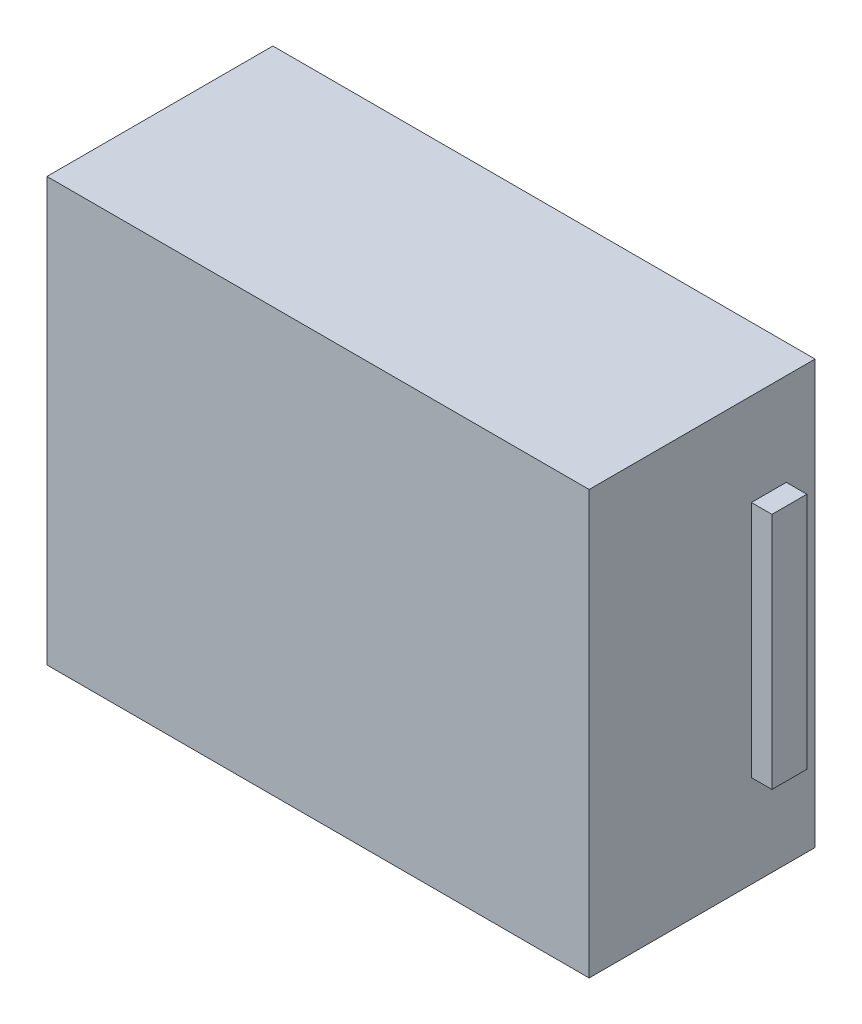
ISO-10303-21;
HEADER;
FILE_DESCRIPTION(('STEP AP214'),'2;1');
FILE_NAME('part.step','',(''),(''),'','','');
FILE_SCHEMA(('AUTOMOTIVE_DESIGN { 1 0 10303 214 1 1 1 1 }'));
ENDSEC;
DATA;
#1=APPLICATION_CONTEXT('core data for automotive mechanical design processes');
#2=APPLICATION_PROTOCOL_DEFINITION('international standard','automotive_design',2000,#1);
#3=PRODUCT_CONTEXT('',#1,'mechanical');
#4=PRODUCT('Part','Part','',(#3));
#5=PRODUCT_RELATED_PRODUCT_CATEGORY('part','',(#4));
#6=PRODUCT_DEFINITION_FORMATION('','',#4);
#7=PRODUCT_DEFINITION_CONTEXT('part definition',#1,'design');
#8=PRODUCT_DEFINITION('design','',#6,#7);
#9=PRODUCT_DEFINITION_SHAPE('','',#8);
#10=(LENGTH_UNIT() NAMED_UNIT(*) SI_UNIT(.MILLI.,.METRE.));
#11=(NAMED_UNIT(*) PLANE_ANGLE_UNIT() SI_UNIT($,.RADIAN.));
#12=(NAMED_UNIT(*) SI_UNIT($,.STERADIAN.) SOLID_ANGLE_UNIT());
#13=UNCERTAINTY_MEASURE_WITH_UNIT(LENGTH_MEASURE(1.E-05),#10,'distance_accuracy_value','');
#14=(GEOMETRIC_REPRESENTATION_CONTEXT(3) GLOBAL_UNCERTAINTY_ASSIGNED_CONTEXT((#13)) GLOBAL_UNIT_ASSIGNED_CONTEXT((#10,
#11,#12)) REPRESENTATION_CONTEXT('',''));
#15=CARTESIAN_POINT('',(0.,0.,0.));
#16=DIRECTION('',(0.,0.,1.));
#17=DIRECTION('',(1.,0.,0.));
#18=AXIS2_PLACEMENT_3D('',#15,#16,#17);
#19=CARTESIAN_POINT('',(132.,0.,55.));
#20=DIRECTION('',(-1.,0.,0.));
#21=DIRECTION('',(0.,0.,1.));
#22=AXIS2_PLACEMENT_3D('',#19,#20,#21);
#23=PLANE('',#22);
#24=DIRECTION('',(0.,1.,0.));
#25=VECTOR('',#24,1.);
#26=CARTESIAN_POINT('',(132.,0.,0.));
#27=LINE('',#26,#25);
#28=CARTESIAN_POINT('',(132.,-103.,0.));
#29=VERTEX_POINT('',#28);
#30=CARTESIAN_POINT('',(132.,0.,0.));
#31=VERTEX_POINT('',#30);
#32=EDGE_CURVE('E144',#29,#31,#27,.T.);
#33=ORIENTED_EDGE('',*,*,#32,.T.);
#34=DIRECTION('',(0.,0.,-1.));
#35=VECTOR('',#34,1.);
#36=CARTESIAN_POINT('',(132.,0.,55.));
#37=LINE('',#36,#35);
#38=CARTESIAN_POINT('',(132.,0.,55.));
#39=VERTEX_POINT('',#38);
#40=EDGE_CURVE('E149',#39,#31,#37,.T.);
#41=ORIENTED_EDGE('',*,*,#40,.F.);
#42=DIRECTION('',(0.,1.,0.));
#43=VECTOR('',#42,1.);
#44=CARTESIAN_POINT('',(132.,0.,55.));
#45=LINE('',#44,#43);
#46=CARTESIAN_POINT('',(132.,-103.,55.));
#47=VERTEX_POINT('',#46);
#48=EDGE_CURVE('E138',#47,#39,#45,.T.);
#49=ORIENTED_EDGE('',*,*,#48,.F.);
#50=DIRECTION('',(0.,0.,-1.));
#51=VECTOR('',#50,1.);
#52=CARTESIAN_POINT('',(132.,-103.,55.));
#53=LINE('',#52,#51);
#54=EDGE_CURVE('E45',#47,#29,#53,.T.);
#55=ORIENTED_EDGE('',*,*,#54,.T.);
#56=EDGE_LOOP('',(#33,#41,#49,#55));
#57=FACE_BOUND('',#56,.T.);
#58=DIRECTION('',(0.,-1.,0.));
#59=VECTOR('',#58,1.);
#60=CARTESIAN_POINT('',(132.,-22.5,15.5));
#61=LINE('',#60,#59);
#62=CARTESIAN_POINT('',(132.,-22.5,15.5));
#63=VERTEX_POINT('',#62);
#64=CARTESIAN_POINT('',(132.,-80.5,15.5));
#65=VERTEX_POINT('',#64);
#66=EDGE_CURVE('E122',#63,#65,#61,.T.);
#67=ORIENTED_EDGE('',*,*,#66,.F.);
#68=DIRECTION('',(0.,0.,1.));
#69=VECTOR('',#68,1.);
#70=CARTESIAN_POINT('',(132.,-22.5,15.5));
#71=LINE('',#70,#69);
#72=CARTESIAN_POINT('',(132.,-22.5,7.00000000000001));
#73=VERTEX_POINT('',#72);
#74=EDGE_CURVE('E119',#73,#63,#71,.T.);
#75=ORIENTED_EDGE('',*,*,#74,.F.);
#76=DIRECTION('',(0.,1.,0.));
#77=VECTOR('',#76,1.);
#78=CARTESIAN_POINT('',(132.,-22.5,7.00000000000001));
#79=LINE('',#78,#77);
#80=CARTESIAN_POINT('',(132.,-80.5,7.00000000000001));
#81=VERTEX_POINT('',#80);
#82=EDGE_CURVE('E57',#81,#73,#79,.T.);
#83=ORIENTED_EDGE('',*,*,#82,.F.);
#84=DIRECTION('',(0.,0.,-1.));
#85=VECTOR('',#84,1.);
#86=CARTESIAN_POINT('',(132.,-80.5,15.5));
#87=LINE('',#86,#85);
#88=EDGE_CURVE('E52',#65,#81,#87,.T.);
#89=ORIENTED_EDGE('',*,*,#88,.F.);
#90=EDGE_LOOP('',(#67,#75,#83,#89));
#91=FACE_BOUND('',#90,.T.);
#92=ADVANCED_FACE('F37',(#57,#91),#23,.F.);
#93=CARTESIAN_POINT('',(0.,0.,55.));
#94=DIRECTION('',(1.,0.,0.));
#95=DIRECTION('',(0.,1.,0.));
#96=AXIS2_PLACEMENT_3D('',#93,#94,#95);
#97=PLANE('',#96);
#98=DIRECTION('',(0.,-1.,0.));
#99=VECTOR('',#98,1.);
#100=CARTESIAN_POINT('',(0.,0.,0.));
#101=LINE('',#100,#99);
#102=CARTESIAN_POINT('',(0.,0.,0.));
#103=VERTEX_POINT('',#102);
#104=CARTESIAN_POINT('',(0.,-103.,0.));
#105=VERTEX_POINT('',#104);
#106=EDGE_CURVE('E123',#103,#105,#101,.T.);
#107=ORIENTED_EDGE('',*,*,#106,.T.);
#108=DIRECTION('',(0.,0.,-1.));
#109=VECTOR('',#108,1.);
#110=CARTESIAN_POINT('',(0.,-103.,55.));
#111=LINE('',#110,#109);
#112=CARTESIAN_POINT('',(0.,-103.,55.));
#113=VERTEX_POINT('',#112);
#114=EDGE_CURVE('E11',#113,#105,#111,.T.);
#115=ORIENTED_EDGE('',*,*,#114,.F.);
#116=DIRECTION('',(0.,-1.,0.));
#117=VECTOR('',#116,1.);
#118=CARTESIAN_POINT('',(0.,0.,55.));
#119=LINE('',#118,#117);
#120=CARTESIAN_POINT('',(0.,0.,55.));
#121=VERTEX_POINT('',#120);
#122=EDGE_CURVE('E132',#121,#113,#119,.T.);
#123=ORIENTED_EDGE('',*,*,#122,.F.);
#124=DIRECTION('',(0.,0.,-1.));
#125=VECTOR('',#124,1.);
#126=CARTESIAN_POINT('',(0.,0.,55.));
#127=LINE('',#126,#125);
#128=EDGE_CURVE('E141',#121,#103,#127,.T.);
#129=ORIENTED_EDGE('',*,*,#128,.T.);
#130=EDGE_LOOP('',(#107,#115,#123,#129));
#131=FACE_BOUND('',#130,.T.);
#132=ADVANCED_FACE('F39',(#131),#97,.F.);
#133=CARTESIAN_POINT('',(0.,-103.,55.));
#134=DIRECTION('',(0.,1.,0.));
#135=DIRECTION('',(0.,0.,1.));
#136=AXIS2_PLACEMENT_3D('',#133,#134,#135);
#137=PLANE('',#136);
#138=DIRECTION('',(1.,0.,0.));
#139=VECTOR('',#138,1.);
#140=CARTESIAN_POINT('',(0.,-103.,0.));
#141=LINE('',#140,#139);
#142=EDGE_CURVE('E126',#105,#29,#141,.T.);
#143=ORIENTED_EDGE('',*,*,#142,.T.);
#144=ORIENTED_EDGE('',*,*,#54,.F.);
#145=DIRECTION('',(1.,0.,0.));
#146=VECTOR('',#145,1.);
#147=CARTESIAN_POINT('',(0.,-103.,55.));
#148=LINE('',#147,#146);
#149=EDGE_CURVE('E135',#113,#47,#148,.T.);
#150=ORIENTED_EDGE('',*,*,#149,.F.);
#151=ORIENTED_EDGE('',*,*,#114,.T.);
#152=EDGE_LOOP('',(#143,#144,#150,#151));
#153=FACE_BOUND('',#152,.T.);
#154=ADVANCED_FACE('F171',(#153),#137,.F.);
#155=CARTESIAN_POINT('',(0.,0.,55.));
#156=DIRECTION('',(0.,-1.,0.));
#157=DIRECTION('',(0.,0.,-1.));
#158=AXIS2_PLACEMENT_3D('',#155,#156,#157);
#159=PLANE('',#158);
#160=DIRECTION('',(-1.,0.,0.));
#161=VECTOR('',#160,1.);
#162=CARTESIAN_POINT('',(0.,0.,0.));
#163=LINE('',#162,#161);
#164=EDGE_CURVE('E136',#31,#103,#163,.T.);
#165=ORIENTED_EDGE('',*,*,#164,.T.);
#166=ORIENTED_EDGE('',*,*,#128,.F.);
#167=DIRECTION('',(-1.,0.,0.));
#168=VECTOR('',#167,1.);
#169=CARTESIAN_POINT('',(0.,0.,55.));
#170=LINE('',#169,#168);
#171=EDGE_CURVE('E140',#39,#121,#170,.T.);
#172=ORIENTED_EDGE('',*,*,#171,.F.);
#173=ORIENTED_EDGE('',*,*,#40,.T.);
#174=EDGE_LOOP('',(#165,#166,#172,#173));
#175=FACE_BOUND('',#174,.T.);
#176=ADVANCED_FACE('F164',(#175),#159,.F.);
#177=CARTESIAN_POINT('',(0.,0.,55.));
#178=DIRECTION('',(0.,0.,1.));
#179=DIRECTION('',(1.,0.,0.));
#180=AXIS2_PLACEMENT_3D('',#177,#178,#179);
#181=PLANE('',#180);
#182=ORIENTED_EDGE('',*,*,#122,.T.);
#183=ORIENTED_EDGE('',*,*,#149,.T.);
#184=ORIENTED_EDGE('',*,*,#48,.T.);
#185=ORIENTED_EDGE('',*,*,#171,.T.);
#186=EDGE_LOOP('',(#182,#183,#184,#185));
#187=FACE_BOUND('',#186,.T.);
#188=ADVANCED_FACE('F170',(#187),#181,.T.);
#189=CARTESIAN_POINT('',(0.,0.,0.));
#190=DIRECTION('',(0.,0.,1.));
#191=DIRECTION('',(1.,0.,0.));
#192=AXIS2_PLACEMENT_3D('',#189,#190,#191);
#193=PLANE('',#192);
#194=ORIENTED_EDGE('',*,*,#106,.F.);
#195=ORIENTED_EDGE('',*,*,#164,.F.);
#196=ORIENTED_EDGE('',*,*,#32,.F.);
#197=ORIENTED_EDGE('',*,*,#142,.F.);
#198=EDGE_LOOP('',(#194,#195,#196,#197));
#199=FACE_BOUND('',#198,.T.);
#200=ADVANCED_FACE('F161',(#199),#193,.F.);
#201=CARTESIAN_POINT('',(137.,-22.5,15.5));
#202=DIRECTION('',(0.,0.,-1.));
#203=DIRECTION('',(0.,1.,0.));
#204=AXIS2_PLACEMENT_3D('',#201,#202,#203);
#205=PLANE('',#204);
#206=ORIENTED_EDGE('',*,*,#66,.T.);
#207=DIRECTION('',(-1.,0.,0.));
#208=VECTOR('',#207,1.);
#209=CARTESIAN_POINT('',(137.,-80.5,15.5));
#210=LINE('',#209,#208);
#211=CARTESIAN_POINT('',(137.,-80.5,15.5));
#212=VERTEX_POINT('',#211);
#213=EDGE_CURVE('E103',#212,#65,#210,.T.);
#214=ORIENTED_EDGE('',*,*,#213,.F.);
#215=DIRECTION('',(0.,-1.,0.));
#216=VECTOR('',#215,1.);
#217=CARTESIAN_POINT('',(137.,-22.5,15.5));
#218=LINE('',#217,#216);
#219=CARTESIAN_POINT('',(137.,-22.5,15.5));
#220=VERTEX_POINT('',#219);
#221=EDGE_CURVE('E110',#220,#212,#218,.T.);
#222=ORIENTED_EDGE('',*,*,#221,.F.);
#223=DIRECTION('',(-1.,0.,0.));
#224=VECTOR('',#223,1.);
#225=CARTESIAN_POINT('',(137.,-22.5,15.5));
#226=LINE('',#225,#224);
#227=EDGE_CURVE('E286',#220,#63,#226,.T.);
#228=ORIENTED_EDGE('',*,*,#227,.T.);
#229=EDGE_LOOP('',(#206,#214,#222,#228));
#230=FACE_BOUND('',#229,.T.);
#231=ADVANCED_FACE('F121',(#230),#205,.F.);
#232=CARTESIAN_POINT('',(137.,-80.5,15.5));
#233=DIRECTION('',(0.,1.,0.));
#234=DIRECTION('',(0.,0.,1.));
#235=AXIS2_PLACEMENT_3D('',#232,#233,#234);
#236=PLANE('',#235);
#237=ORIENTED_EDGE('',*,*,#88,.T.);
#238=DIRECTION('',(-1.,0.,0.));
#239=VECTOR('',#238,1.);
#240=CARTESIAN_POINT('',(137.,-80.5,7.00000000000001));
#241=LINE('',#240,#239);
#242=CARTESIAN_POINT('',(137.,-80.5,7.00000000000001));
#243=VERTEX_POINT('',#242);
#244=EDGE_CURVE('E106',#243,#81,#241,.T.);
#245=ORIENTED_EDGE('',*,*,#244,.F.);
#246=DIRECTION('',(0.,0.,-1.));
#247=VECTOR('',#246,1.);
#248=CARTESIAN_POINT('',(137.,-80.5,15.5));
#249=LINE('',#248,#247);
#250=EDGE_CURVE('E99',#212,#243,#249,.T.);
#251=ORIENTED_EDGE('',*,*,#250,.F.);
#252=ORIENTED_EDGE('',*,*,#213,.T.);
#253=EDGE_LOOP('',(#237,#245,#251,#252));
#254=FACE_BOUND('',#253,.T.);
#255=ADVANCED_FACE('F101',(#254),#236,.F.);
#256=CARTESIAN_POINT('',(137.,-22.5,7.00000000000001));
#257=DIRECTION('',(0.,0.,1.));
#258=DIRECTION('',(1.,0.,0.));
#259=AXIS2_PLACEMENT_3D('',#256,#257,#258);
#260=PLANE('',#259);
#261=ORIENTED_EDGE('',*,*,#82,.T.);
#262=DIRECTION('',(-1.,0.,0.));
#263=VECTOR('',#262,1.);
#264=CARTESIAN_POINT('',(137.,-22.5,7.00000000000001));
#265=LINE('',#264,#263);
#266=CARTESIAN_POINT('',(137.,-22.5,7.00000000000001));
#267=VERTEX_POINT('',#266);
#268=EDGE_CURVE('E128',#267,#73,#265,.T.);
#269=ORIENTED_EDGE('',*,*,#268,.F.);
#270=DIRECTION('',(0.,1.,0.));
#271=VECTOR('',#270,1.);
#272=CARTESIAN_POINT('',(137.,-22.5,7.00000000000001));
#273=LINE('',#272,#271);
#274=EDGE_CURVE('E109',#243,#267,#273,.T.);
#275=ORIENTED_EDGE('',*,*,#274,.F.);
#276=ORIENTED_EDGE('',*,*,#244,.T.);
#277=EDGE_LOOP('',(#261,#269,#275,#276));
#278=FACE_BOUND('',#277,.T.);
#279=ADVANCED_FACE('F191',(#278),#260,.F.);
#280=CARTESIAN_POINT('',(137.,-22.5,15.5));
#281=DIRECTION('',(0.,-1.,0.));
#282=DIRECTION('',(0.,0.,-1.));
#283=AXIS2_PLACEMENT_3D('',#280,#281,#282);
#284=PLANE('',#283);
#285=ORIENTED_EDGE('',*,*,#74,.T.);
#286=ORIENTED_EDGE('',*,*,#227,.F.);
#287=DIRECTION('',(0.,0.,1.));
#288=VECTOR('',#287,1.);
#289=CARTESIAN_POINT('',(137.,-22.5,15.5));
#290=LINE('',#289,#288);
#291=EDGE_CURVE('E115',#267,#220,#290,.T.);
#292=ORIENTED_EDGE('',*,*,#291,.F.);
#293=ORIENTED_EDGE('',*,*,#268,.T.);
#294=EDGE_LOOP('',(#285,#286,#292,#293));
#295=FACE_BOUND('',#294,.T.);
#296=ADVANCED_FACE('F194',(#295),#284,.F.);
#297=CARTESIAN_POINT('',(137.,0.,0.));
#298=DIRECTION('',(1.,0.,0.));
#299=DIRECTION('',(0.,0.,-1.));
#300=AXIS2_PLACEMENT_3D('',#297,#298,#299);
#301=PLANE('',#300);
#302=ORIENTED_EDGE('',*,*,#221,.T.);
#303=ORIENTED_EDGE('',*,*,#250,.T.);
#304=ORIENTED_EDGE('',*,*,#274,.T.);
#305=ORIENTED_EDGE('',*,*,#291,.T.);
#306=EDGE_LOOP('',(#302,#303,#304,#305));
#307=FACE_BOUND('',#306,.T.);
#308=ADVANCED_FACE('F113',(#307),#301,.T.);
#309=CLOSED_SHELL('',(#92,#132,#154,#176,#188,#200,#231,#255,#279,#296,#308));
#310=MANIFOLD_SOLID_BREP('B2',#309);
#311=ADVANCED_BREP_SHAPE_REPRESENTATION('',(#18,#310),#14);
#312=SHAPE_DEFINITION_REPRESENTATION(#9,#311);
ENDSEC;
END-ISO-10303-21;
